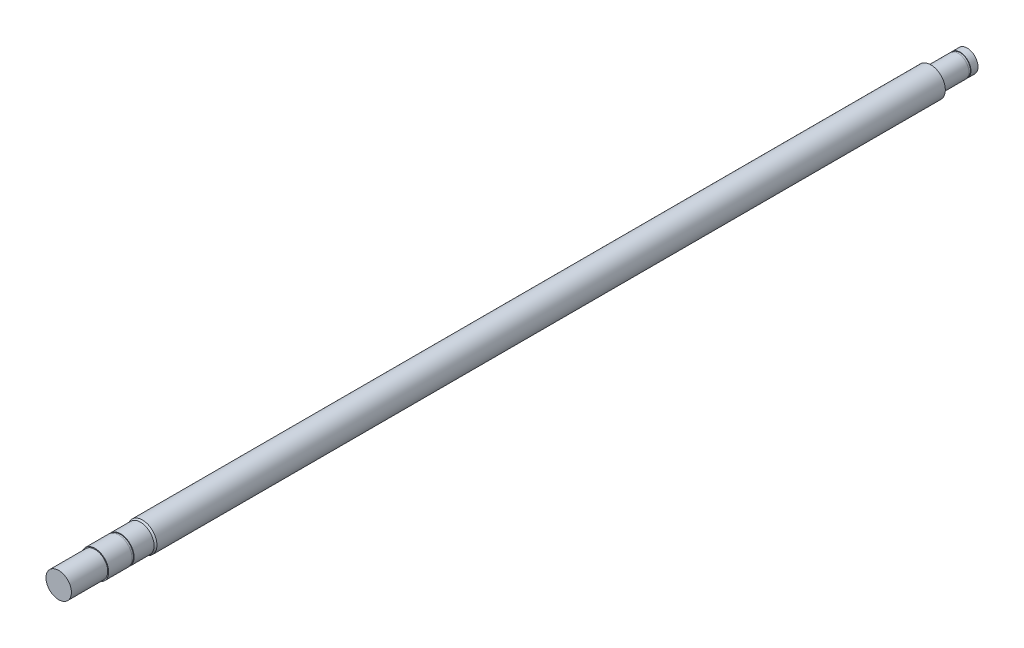
ISO-10303-21;
HEADER;
FILE_DESCRIPTION(('STEP AP214'),'2;1');
FILE_NAME('part.step','',(''),(''),'','','');
FILE_SCHEMA(('AUTOMOTIVE_DESIGN { 1 0 10303 214 1 1 1 1 }'));
ENDSEC;
DATA;
#1=APPLICATION_CONTEXT('core data for automotive mechanical design processes');
#2=APPLICATION_PROTOCOL_DEFINITION('international standard','automotive_design',2000,#1);
#3=PRODUCT_CONTEXT('',#1,'mechanical');
#4=PRODUCT('Part','Part','',(#3));
#5=PRODUCT_RELATED_PRODUCT_CATEGORY('part','',(#4));
#6=PRODUCT_DEFINITION_FORMATION('','',#4);
#7=PRODUCT_DEFINITION_CONTEXT('part definition',#1,'design');
#8=PRODUCT_DEFINITION('design','',#6,#7);
#9=PRODUCT_DEFINITION_SHAPE('','',#8);
#10=(LENGTH_UNIT() NAMED_UNIT(*) SI_UNIT(.MILLI.,.METRE.));
#11=(NAMED_UNIT(*) PLANE_ANGLE_UNIT() SI_UNIT($,.RADIAN.));
#12=(NAMED_UNIT(*) SI_UNIT($,.STERADIAN.) SOLID_ANGLE_UNIT());
#13=UNCERTAINTY_MEASURE_WITH_UNIT(LENGTH_MEASURE(1.E-05),#10,'distance_accuracy_value','');
#14=(GEOMETRIC_REPRESENTATION_CONTEXT(3) GLOBAL_UNCERTAINTY_ASSIGNED_CONTEXT((#13)) GLOBAL_UNIT_ASSIGNED_CONTEXT((#10,
#11,#12)) REPRESENTATION_CONTEXT('',''));
#15=CARTESIAN_POINT('',(0.,0.,0.));
#16=DIRECTION('',(0.,0.,1.));
#17=DIRECTION('',(1.,0.,0.));
#18=AXIS2_PLACEMENT_3D('',#15,#16,#17);
#19=CARTESIAN_POINT('',(0.,0.,-45.));
#20=DIRECTION('',(0.,0.,1.));
#21=DIRECTION('',(1.,0.,0.));
#22=AXIS2_PLACEMENT_3D('',#19,#20,#21);
#23=CYLINDRICAL_SURFACE('',#22,7.5);
#24=CARTESIAN_POINT('',(0.,0.,-32.9));
#25=DIRECTION('',(0.,0.,1.));
#26=DIRECTION('',(1.,0.,0.));
#27=AXIS2_PLACEMENT_3D('',#24,#25,#26);
#28=CIRCLE('',#27,7.50000000000001);
#29=CARTESIAN_POINT('',(7.50000000000001,0.,-32.9));
#30=VERTEX_POINT('',#29);
#31=EDGE_CURVE('E76',#30,#30,#28,.T.);
#32=ORIENTED_EDGE('',*,*,#31,.T.);
#33=EDGE_LOOP('',(#32));
#34=FACE_BOUND('',#33,.T.);
#35=CARTESIAN_POINT('',(0.,0.,-20.));
#36=DIRECTION('',(0.,0.,1.));
#37=DIRECTION('',(1.,0.,0.));
#38=AXIS2_PLACEMENT_3D('',#35,#36,#37);
#39=CIRCLE('',#38,7.5);
#40=CARTESIAN_POINT('',(7.5,0.,-20.));
#41=VERTEX_POINT('',#40);
#42=EDGE_CURVE('E63',#41,#41,#39,.T.);
#43=ORIENTED_EDGE('',*,*,#42,.F.);
#44=EDGE_LOOP('',(#43));
#45=FACE_BOUND('',#44,.T.);
#46=ADVANCED_FACE('F50',(#34,#45),#23,.T.);
#47=CARTESIAN_POINT('',(0.,0.,-20.));
#48=DIRECTION('',(0.,0.,1.));
#49=DIRECTION('',(1.,0.,0.));
#50=AXIS2_PLACEMENT_3D('',#47,#48,#49);
#51=PLANE('',#50);
#52=CARTESIAN_POINT('',(0.,0.,-20.));
#53=DIRECTION('',(0.,0.,1.));
#54=DIRECTION('',(1.,0.,0.));
#55=AXIS2_PLACEMENT_3D('',#52,#53,#54);
#56=CIRCLE('',#55,7.);
#57=CARTESIAN_POINT('',(7.,0.,-20.));
#58=VERTEX_POINT('',#57);
#59=EDGE_CURVE('E12',#58,#58,#56,.T.);
#60=ORIENTED_EDGE('',*,*,#59,.F.);
#61=EDGE_LOOP('',(#60));
#62=FACE_BOUND('',#61,.T.);
#63=ORIENTED_EDGE('',*,*,#42,.T.);
#64=EDGE_LOOP('',(#63));
#65=FACE_BOUND('',#64,.T.);
#66=ADVANCED_FACE('F151',(#62,#65),#51,.T.);
#67=CARTESIAN_POINT('',(0.,0.,-20.));
#68=DIRECTION('',(0.,0.,1.));
#69=DIRECTION('',(1.,0.,0.));
#70=AXIS2_PLACEMENT_3D('',#67,#68,#69);
#71=CYLINDRICAL_SURFACE('',#70,7.);
#72=ORIENTED_EDGE('',*,*,#59,.T.);
#73=EDGE_LOOP('',(#72));
#74=FACE_BOUND('',#73,.T.);
#75=CARTESIAN_POINT('',(0.,0.,0.));
#76=DIRECTION('',(0.,0.,1.));
#77=DIRECTION('',(1.,0.,0.));
#78=AXIS2_PLACEMENT_3D('',#75,#76,#77);
#79=CIRCLE('',#78,7.);
#80=CARTESIAN_POINT('',(7.,0.,0.));
#81=VERTEX_POINT('',#80);
#82=EDGE_CURVE('E58',#81,#81,#79,.T.);
#83=ORIENTED_EDGE('',*,*,#82,.F.);
#84=EDGE_LOOP('',(#83));
#85=FACE_BOUND('',#84,.T.);
#86=ADVANCED_FACE('F159',(#74,#85),#71,.T.);
#87=CARTESIAN_POINT('',(0.,0.,0.));
#88=DIRECTION('',(0.,0.,-1.));
#89=DIRECTION('',(-1.,0.,0.));
#90=AXIS2_PLACEMENT_3D('',#87,#88,#89);
#91=PLANE('',#90);
#92=ORIENTED_EDGE('',*,*,#82,.T.);
#93=EDGE_LOOP('',(#92));
#94=FACE_BOUND('',#93,.T.);
#95=ADVANCED_FACE('F52',(#94),#91,.F.);
#96=CARTESIAN_POINT('',(7.50000000000001,0.,-32.9));
#97=DIRECTION('',(0.,0.,1.));
#98=DIRECTION('',(1.,0.,0.));
#99=AXIS2_PLACEMENT_3D('',#96,#97,#98);
#100=PLANE('',#99);
#101=ORIENTED_EDGE('',*,*,#31,.F.);
#102=EDGE_LOOP('',(#101));
#103=FACE_BOUND('',#102,.T.);
#104=CARTESIAN_POINT('',(0.,0.,-32.9));
#105=DIRECTION('',(0.,0.,1.));
#106=DIRECTION('',(1.,0.,0.));
#107=AXIS2_PLACEMENT_3D('',#104,#105,#106);
#108=CIRCLE('',#107,7.15);
#109=CARTESIAN_POINT('',(7.15,0.,-32.9));
#110=VERTEX_POINT('',#109);
#111=EDGE_CURVE('E67',#110,#110,#108,.T.);
#112=ORIENTED_EDGE('',*,*,#111,.T.);
#113=EDGE_LOOP('',(#112));
#114=FACE_BOUND('',#113,.T.);
#115=ADVANCED_FACE('F260',(#103,#114),#100,.F.);
#116=CARTESIAN_POINT('',(0.,0.,-20.));
#117=DIRECTION('',(0.,0.,1.));
#118=DIRECTION('',(1.,0.,0.));
#119=AXIS2_PLACEMENT_3D('',#116,#117,#118);
#120=CYLINDRICAL_SURFACE('',#119,7.15);
#121=ORIENTED_EDGE('',*,*,#111,.F.);
#122=EDGE_LOOP('',(#121));
#123=FACE_BOUND('',#122,.T.);
#124=CARTESIAN_POINT('',(0.,0.,-34.));
#125=DIRECTION('',(0.,0.,1.));
#126=DIRECTION('',(1.,0.,0.));
#127=AXIS2_PLACEMENT_3D('',#124,#125,#126);
#128=CIRCLE('',#127,7.15);
#129=CARTESIAN_POINT('',(7.15,0.,-34.));
#130=VERTEX_POINT('',#129);
#131=EDGE_CURVE('E70',#130,#130,#128,.T.);
#132=ORIENTED_EDGE('',*,*,#131,.T.);
#133=EDGE_LOOP('',(#132));
#134=FACE_BOUND('',#133,.T.);
#135=ADVANCED_FACE('F174',(#123,#134),#120,.T.);
#136=CARTESIAN_POINT('',(7.50000000000001,0.,-34.));
#137=DIRECTION('',(0.,0.,-1.));
#138=DIRECTION('',(-1.,0.,0.));
#139=AXIS2_PLACEMENT_3D('',#136,#137,#138);
#140=PLANE('',#139);
#141=ORIENTED_EDGE('',*,*,#131,.F.);
#142=EDGE_LOOP('',(#141));
#143=FACE_BOUND('',#142,.T.);
#144=CARTESIAN_POINT('',(0.,0.,-34.));
#145=DIRECTION('',(0.,0.,1.));
#146=DIRECTION('',(1.,0.,0.));
#147=AXIS2_PLACEMENT_3D('',#144,#145,#146);
#148=CIRCLE('',#147,7.50000000000001);
#149=CARTESIAN_POINT('',(7.50000000000001,0.,-34.));
#150=VERTEX_POINT('',#149);
#151=EDGE_CURVE('E73',#150,#150,#148,.T.);
#152=ORIENTED_EDGE('',*,*,#151,.T.);
#153=EDGE_LOOP('',(#152));
#154=FACE_BOUND('',#153,.T.);
#155=ADVANCED_FACE('F166',(#143,#154),#140,.F.);
#156=ORIENTED_EDGE('',*,*,#151,.F.);
#157=EDGE_LOOP('',(#156));
#158=FACE_BOUND('',#157,.T.);
#159=CARTESIAN_POINT('',(0.,0.,-45.));
#160=DIRECTION('',(0.,0.,1.));
#161=DIRECTION('',(1.,0.,0.));
#162=AXIS2_PLACEMENT_3D('',#159,#160,#161);
#163=CIRCLE('',#162,7.5);
#164=CARTESIAN_POINT('',(7.5,0.,-45.));
#165=VERTEX_POINT('',#164);
#166=EDGE_CURVE('E83',#165,#165,#163,.F.);
#167=ORIENTED_EDGE('',*,*,#166,.F.);
#168=EDGE_LOOP('',(#167));
#169=FACE_BOUND('',#168,.T.);
#170=ADVANCED_FACE('F154',(#158,#169),#23,.T.);
#171=CARTESIAN_POINT('',(0.,0.,-45.));
#172=DIRECTION('',(0.,0.,-1.));
#173=DIRECTION('',(-1.,0.,0.));
#174=AXIS2_PLACEMENT_3D('',#171,#172,#173);
#175=CONICAL_SURFACE('',#174,6.9175,0.785398163397448);
#176=CARTESIAN_POINT('',(0.,0.,-46.0824999999999));
#177=DIRECTION('',(0.,0.,-1.));
#178=DIRECTION('',(-1.,0.,0.));
#179=AXIS2_PLACEMENT_3D('',#176,#177,#178);
#180=CIRCLE('',#179,7.99999999999995);
#181=CARTESIAN_POINT('',(-7.99999999999995,0.,-46.0824999999999));
#182=VERTEX_POINT('',#181);
#183=EDGE_CURVE('E88',#182,#182,#180,.T.);
#184=ORIENTED_EDGE('',*,*,#183,.F.);
#185=EDGE_LOOP('',(#184));
#186=FACE_BOUND('',#185,.T.);
#187=CARTESIAN_POINT('',(0.,0.,-45.));
#188=DIRECTION('',(0.,0.,-1.));
#189=DIRECTION('',(-1.,0.,0.));
#190=AXIS2_PLACEMENT_3D('',#187,#188,#189);
#191=CIRCLE('',#190,6.9175);
#192=CARTESIAN_POINT('',(-6.9175,0.,-45.));
#193=VERTEX_POINT('',#192);
#194=EDGE_CURVE('E91',#193,#193,#191,.T.);
#195=ORIENTED_EDGE('',*,*,#194,.T.);
#196=EDGE_LOOP('',(#195));
#197=FACE_BOUND('',#196,.T.);
#198=ADVANCED_FACE('F165',(#186,#197),#175,.T.);
#199=CARTESIAN_POINT('',(6.9175,0.,-45.));
#200=DIRECTION('',(0.,0.,1.));
#201=DIRECTION('',(1.,0.,0.));
#202=AXIS2_PLACEMENT_3D('',#199,#200,#201);
#203=PLANE('',#202);
#204=ORIENTED_EDGE('',*,*,#166,.T.);
#205=EDGE_LOOP('',(#204));
#206=FACE_BOUND('',#205,.T.);
#207=ORIENTED_EDGE('',*,*,#194,.F.);
#208=EDGE_LOOP('',(#207));
#209=FACE_BOUND('',#208,.T.);
#210=ADVANCED_FACE('F134',(#206,#209),#203,.F.);
#211=CARTESIAN_POINT('',(0.,0.,-480.));
#212=DIRECTION('',(0.,0.,-1.));
#213=DIRECTION('',(-1.,0.,0.));
#214=AXIS2_PLACEMENT_3D('',#211,#212,#213);
#215=CYLINDRICAL_SURFACE('',#214,6.);
#216=CARTESIAN_POINT('',(0.,0.,-495.));
#217=DIRECTION('',(0.,0.,-1.));
#218=DIRECTION('',(-1.,0.,0.));
#219=AXIS2_PLACEMENT_3D('',#216,#217,#218);
#220=CIRCLE('',#219,6.00000000000001);
#221=CARTESIAN_POINT('',(-6.00000000000001,0.,-495.));
#222=VERTEX_POINT('',#221);
#223=EDGE_CURVE('E100',#222,#222,#220,.T.);
#224=ORIENTED_EDGE('',*,*,#223,.F.);
#225=EDGE_LOOP('',(#224));
#226=FACE_BOUND('',#225,.T.);
#227=CARTESIAN_POINT('',(0.,0.,-480.));
#228=DIRECTION('',(0.,0.,-1.));
#229=DIRECTION('',(-1.,0.,0.));
#230=AXIS2_PLACEMENT_3D('',#227,#228,#229);
#231=CIRCLE('',#230,6.);
#232=CARTESIAN_POINT('',(-6.,0.,-480.));
#233=VERTEX_POINT('',#232);
#234=EDGE_CURVE('E82',#233,#233,#231,.T.);
#235=ORIENTED_EDGE('',*,*,#234,.T.);
#236=EDGE_LOOP('',(#235));
#237=FACE_BOUND('',#236,.T.);
#238=ADVANCED_FACE('F130',(#226,#237),#215,.T.);
#239=CARTESIAN_POINT('',(0.,0.,-480.));
#240=DIRECTION('',(0.,0.,-1.));
#241=DIRECTION('',(-1.,0.,0.));
#242=AXIS2_PLACEMENT_3D('',#239,#240,#241);
#243=PLANE('',#242);
#244=CARTESIAN_POINT('',(0.,0.,-480.));
#245=DIRECTION('',(0.,0.,-1.));
#246=DIRECTION('',(-1.,0.,0.));
#247=AXIS2_PLACEMENT_3D('',#244,#245,#246);
#248=CIRCLE('',#247,8.);
#249=CARTESIAN_POINT('',(-8.,0.,-480.));
#250=VERTEX_POINT('',#249);
#251=EDGE_CURVE('E54',#250,#250,#248,.F.);
#252=ORIENTED_EDGE('',*,*,#251,.F.);
#253=EDGE_LOOP('',(#252));
#254=FACE_BOUND('',#253,.T.);
#255=ORIENTED_EDGE('',*,*,#234,.F.);
#256=EDGE_LOOP('',(#255));
#257=FACE_BOUND('',#256,.T.);
#258=ADVANCED_FACE('F133',(#254,#257),#243,.T.);
#259=CARTESIAN_POINT('',(0.,0.,0.));
#260=DIRECTION('',(0.,0.,-1.));
#261=DIRECTION('',(-1.,0.,0.));
#262=AXIS2_PLACEMENT_3D('',#259,#260,#261);
#263=CYLINDRICAL_SURFACE('',#262,8.);
#264=ORIENTED_EDGE('',*,*,#183,.T.);
#265=EDGE_LOOP('',(#264));
#266=FACE_BOUND('',#265,.T.);
#267=ORIENTED_EDGE('',*,*,#251,.T.);
#268=EDGE_LOOP('',(#267));
#269=FACE_BOUND('',#268,.T.);
#270=ADVANCED_FACE('F114',(#266,#269),#263,.T.);
#271=CARTESIAN_POINT('',(-6.00000000000001,0.,-496.1));
#272=DIRECTION('',(0.,0.,-1.));
#273=DIRECTION('',(-1.,0.,0.));
#274=AXIS2_PLACEMENT_3D('',#271,#272,#273);
#275=PLANE('',#274);
#276=CARTESIAN_POINT('',(0.,0.,-496.1));
#277=DIRECTION('',(0.,0.,-1.));
#278=DIRECTION('',(-1.,0.,0.));
#279=AXIS2_PLACEMENT_3D('',#276,#277,#278);
#280=CIRCLE('',#279,6.00000000000001);
#281=CARTESIAN_POINT('',(-6.00000000000001,0.,-496.1));
#282=VERTEX_POINT('',#281);
#283=EDGE_CURVE('E103',#282,#282,#280,.T.);
#284=ORIENTED_EDGE('',*,*,#283,.F.);
#285=EDGE_LOOP('',(#284));
#286=FACE_BOUND('',#285,.T.);
#287=CARTESIAN_POINT('',(0.,0.,-496.1));
#288=DIRECTION('',(0.,0.,-1.));
#289=DIRECTION('',(-1.,0.,0.));
#290=AXIS2_PLACEMENT_3D('',#287,#288,#289);
#291=CIRCLE('',#290,5.75000000000001);
#292=CARTESIAN_POINT('',(-5.75000000000001,0.,-496.1));
#293=VERTEX_POINT('',#292);
#294=EDGE_CURVE('E94',#293,#293,#291,.T.);
#295=ORIENTED_EDGE('',*,*,#294,.T.);
#296=EDGE_LOOP('',(#295));
#297=FACE_BOUND('',#296,.T.);
#298=ADVANCED_FACE('F110',(#286,#297),#275,.F.);
#299=CARTESIAN_POINT('',(0.,0.,-500.));
#300=DIRECTION('',(0.,0.,-1.));
#301=DIRECTION('',(-1.,0.,0.));
#302=AXIS2_PLACEMENT_3D('',#299,#300,#301);
#303=CYLINDRICAL_SURFACE('',#302,5.75000000000001);
#304=ORIENTED_EDGE('',*,*,#294,.F.);
#305=EDGE_LOOP('',(#304));
#306=FACE_BOUND('',#305,.T.);
#307=CARTESIAN_POINT('',(0.,0.,-495.));
#308=DIRECTION('',(0.,0.,-1.));
#309=DIRECTION('',(-1.,0.,0.));
#310=AXIS2_PLACEMENT_3D('',#307,#308,#309);
#311=CIRCLE('',#310,5.75000000000001);
#312=CARTESIAN_POINT('',(-5.75000000000001,0.,-495.));
#313=VERTEX_POINT('',#312);
#314=EDGE_CURVE('E97',#313,#313,#311,.T.);
#315=ORIENTED_EDGE('',*,*,#314,.T.);
#316=EDGE_LOOP('',(#315));
#317=FACE_BOUND('',#316,.T.);
#318=ADVANCED_FACE('F113',(#306,#317),#303,.T.);
#319=CARTESIAN_POINT('',(-6.00000000000001,0.,-495.));
#320=DIRECTION('',(0.,0.,1.));
#321=DIRECTION('',(1.,0.,0.));
#322=AXIS2_PLACEMENT_3D('',#319,#320,#321);
#323=PLANE('',#322);
#324=ORIENTED_EDGE('',*,*,#314,.F.);
#325=EDGE_LOOP('',(#324));
#326=FACE_BOUND('',#325,.T.);
#327=ORIENTED_EDGE('',*,*,#223,.T.);
#328=EDGE_LOOP('',(#327));
#329=FACE_BOUND('',#328,.T.);
#330=ADVANCED_FACE('F120',(#326,#329),#323,.F.);
#331=CARTESIAN_POINT('',(0.,0.,-500.));
#332=DIRECTION('',(0.,0.,-1.));
#333=DIRECTION('',(-1.,0.,0.));
#334=AXIS2_PLACEMENT_3D('',#331,#332,#333);
#335=PLANE('',#334);
#336=CARTESIAN_POINT('',(0.,0.,-500.));
#337=DIRECTION('',(0.,0.,-1.));
#338=DIRECTION('',(-1.,0.,0.));
#339=AXIS2_PLACEMENT_3D('',#336,#337,#338);
#340=CIRCLE('',#339,6.);
#341=CARTESIAN_POINT('',(-6.,0.,-500.));
#342=VERTEX_POINT('',#341);
#343=EDGE_CURVE('E79',#342,#342,#340,.T.);
#344=ORIENTED_EDGE('',*,*,#343,.T.);
#345=EDGE_LOOP('',(#344));
#346=FACE_BOUND('',#345,.T.);
#347=ADVANCED_FACE('F126',(#346),#335,.T.);
#348=ORIENTED_EDGE('',*,*,#283,.T.);
#349=EDGE_LOOP('',(#348));
#350=FACE_BOUND('',#349,.T.);
#351=ORIENTED_EDGE('',*,*,#343,.F.);
#352=EDGE_LOOP('',(#351));
#353=FACE_BOUND('',#352,.T.);
#354=ADVANCED_FACE('F107',(#350,#353),#215,.T.);
#355=CLOSED_SHELL('',(#46,#66,#86,#95,#115,#135,#155,#170,#198,#210,#238,#258,#270,#298,#318,
#330,#347,#354));
#356=MANIFOLD_SOLID_BREP('B2',#355);
#357=ADVANCED_BREP_SHAPE_REPRESENTATION('',(#18,#356),#14);
#358=SHAPE_DEFINITION_REPRESENTATION(#9,#357);
ENDSEC;
END-ISO-10303-21;
